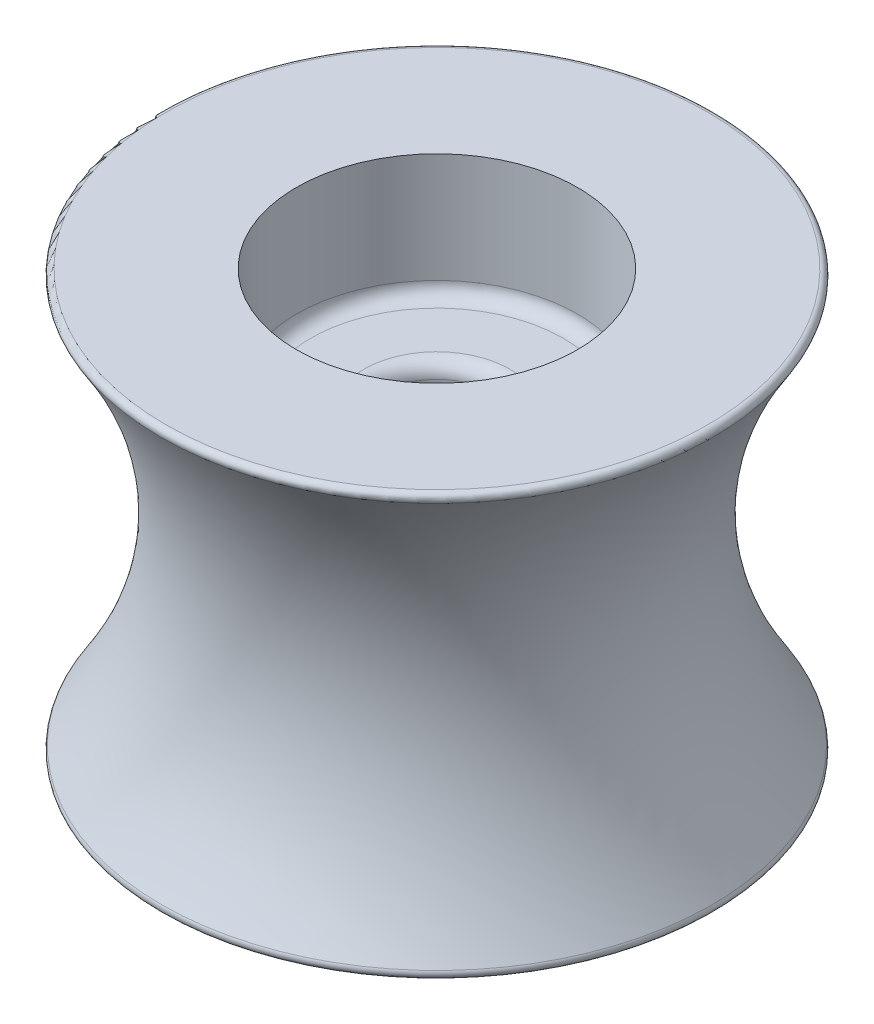
ISO-10303-21;
HEADER;
FILE_DESCRIPTION(('STEP AP214'),'2;1');
FILE_NAME('part.step','',(''),(''),'','','');
FILE_SCHEMA(('AUTOMOTIVE_DESIGN { 1 0 10303 214 1 1 1 1 }'));
ENDSEC;
DATA;
#1=APPLICATION_CONTEXT('core data for automotive mechanical design processes');
#2=APPLICATION_PROTOCOL_DEFINITION('international standard','automotive_design',2000,#1);
#3=PRODUCT_CONTEXT('',#1,'mechanical');
#4=PRODUCT('Part','Part','',(#3));
#5=PRODUCT_RELATED_PRODUCT_CATEGORY('part','',(#4));
#6=PRODUCT_DEFINITION_FORMATION('','',#4);
#7=PRODUCT_DEFINITION_CONTEXT('part definition',#1,'design');
#8=PRODUCT_DEFINITION('design','',#6,#7);
#9=PRODUCT_DEFINITION_SHAPE('','',#8);
#10=(LENGTH_UNIT() NAMED_UNIT(*) SI_UNIT(.MILLI.,.METRE.));
#11=(NAMED_UNIT(*) PLANE_ANGLE_UNIT() SI_UNIT($,.RADIAN.));
#12=(NAMED_UNIT(*) SI_UNIT($,.STERADIAN.) SOLID_ANGLE_UNIT());
#13=UNCERTAINTY_MEASURE_WITH_UNIT(LENGTH_MEASURE(1.E-05),#10,'distance_accuracy_value','');
#14=(GEOMETRIC_REPRESENTATION_CONTEXT(3) GLOBAL_UNCERTAINTY_ASSIGNED_CONTEXT((#13)) GLOBAL_UNIT_ASSIGNED_CONTEXT((#10,
#11,#12)) REPRESENTATION_CONTEXT('',''));
#15=CARTESIAN_POINT('',(0.,0.,0.));
#16=DIRECTION('',(0.,0.,1.));
#17=DIRECTION('',(1.,0.,0.));
#18=AXIS2_PLACEMENT_3D('',#15,#16,#17);
#19=CARTESIAN_POINT('',(0.,-9.525,0.));
#20=DIRECTION('',(0.,1.,0.));
#21=DIRECTION('',(0.,0.,1.));
#22=AXIS2_PLACEMENT_3D('',#19,#20,#21);
#23=CYLINDRICAL_SURFACE('',#22,2.667);
#24=CARTESIAN_POINT('',(0.,-3.302,0.));
#25=DIRECTION('',(0.,-1.,0.));
#26=DIRECTION('',(0.,0.,-1.));
#27=AXIS2_PLACEMENT_3D('',#24,#25,#26);
#28=CIRCLE('',#27,2.667);
#29=CARTESIAN_POINT('',(0.,-3.302,-2.667));
#30=VERTEX_POINT('',#29);
#31=EDGE_CURVE('E45',#30,#30,#28,.T.);
#32=ORIENTED_EDGE('',*,*,#31,.T.);
#33=EDGE_LOOP('',(#32));
#34=FACE_BOUND('',#33,.T.);
#35=CARTESIAN_POINT('',(0.,3.302,0.));
#36=DIRECTION('',(0.,1.,0.));
#37=DIRECTION('',(0.,0.,1.));
#38=AXIS2_PLACEMENT_3D('',#35,#36,#37);
#39=CIRCLE('',#38,2.667);
#40=CARTESIAN_POINT('',(0.,3.302,2.667));
#41=VERTEX_POINT('',#40);
#42=EDGE_CURVE('E50',#41,#41,#39,.T.);
#43=ORIENTED_EDGE('',*,*,#42,.T.);
#44=EDGE_LOOP('',(#43));
#45=FACE_BOUND('',#44,.T.);
#46=ADVANCED_FACE('F37',(#34,#45),#23,.F.);
#47=CARTESIAN_POINT('',(0.,9.525,0.));
#48=DIRECTION('',(0.,-1.,0.));
#49=DIRECTION('',(0.,0.,-1.));
#50=AXIS2_PLACEMENT_3D('',#47,#48,#49);
#51=PLANE('',#50);
#52=CARTESIAN_POINT('',(0.,9.525,0.));
#53=DIRECTION('',(0.,-1.,0.));
#54=DIRECTION('',(0.,0.,-1.));
#55=AXIS2_PLACEMENT_3D('',#52,#53,#54);
#56=CIRCLE('',#55,12.2307979026779);
#57=CARTESIAN_POINT('',(0.,9.525,-12.2307979026779));
#58=VERTEX_POINT('',#57);
#59=EDGE_CURVE('E77',#58,#58,#56,.F.);
#60=ORIENTED_EDGE('',*,*,#59,.T.);
#61=EDGE_LOOP('',(#60));
#62=FACE_BOUND('',#61,.T.);
#63=CARTESIAN_POINT('',(0.,9.525,0.));
#64=DIRECTION('',(0.,1.,0.));
#65=DIRECTION('',(0.,0.,1.));
#66=AXIS2_PLACEMENT_3D('',#63,#64,#65);
#67=CIRCLE('',#66,6.35);
#68=CARTESIAN_POINT('',(0.,9.525,6.35));
#69=VERTEX_POINT('',#68);
#70=EDGE_CURVE('E93',#69,#69,#67,.T.);
#71=ORIENTED_EDGE('',*,*,#70,.F.);
#72=EDGE_LOOP('',(#71));
#73=FACE_BOUND('',#72,.T.);
#74=ADVANCED_FACE('F108',(#62,#73),#51,.F.);
#75=CARTESIAN_POINT('',(12.7,-9.525,0.));
#76=CARTESIAN_POINT('',(6.35,0.,0.));
#77=CARTESIAN_POINT('',(12.7,9.525,0.));
#78=B_SPLINE_CURVE_WITH_KNOTS('',2,(#75,#76,#77),.UNSPECIFIED.,.F.,.F.,(3,3),(0.,1.),.UNSPECIFIED.);
#79=CARTESIAN_POINT('',(0.,9.525,0.));
#80=DIRECTION('',(0.,1.,0.));
#81=AXIS1_PLACEMENT('',#79,#80);
#82=SURFACE_OF_REVOLUTION('',#78,#81);
#83=CARTESIAN_POINT('',(0.,-9.13418467484588,0.));
#84=DIRECTION('',(0.,1.,0.));
#85=DIRECTION('',(0.,0.,1.));
#86=AXIS2_PLACEMENT_3D('',#83,#84,#85);
#87=CIRCLE('',#86,12.4448015634012);
#88=CARTESIAN_POINT('',(0.,-9.13418467484588,12.4448015634012));
#89=VERTEX_POINT('',#88);
#90=EDGE_CURVE('E85',#89,#89,#87,.T.);
#91=ORIENTED_EDGE('',*,*,#90,.T.);
#92=EDGE_LOOP('',(#91));
#93=FACE_BOUND('',#92,.T.);
#94=CARTESIAN_POINT('',(0.,9.13418467484587,0.));
#95=DIRECTION('',(0.,1.,0.));
#96=DIRECTION('',(0.,0.,1.));
#97=AXIS2_PLACEMENT_3D('',#94,#95,#96);
#98=CIRCLE('',#97,12.4448015634012);
#99=CARTESIAN_POINT('',(0.,9.13418467484587,12.4448015634012));
#100=VERTEX_POINT('',#99);
#101=EDGE_CURVE('E89',#100,#100,#98,.F.);
#102=ORIENTED_EDGE('',*,*,#101,.T.);
#103=EDGE_LOOP('',(#102));
#104=FACE_BOUND('',#103,.T.);
#105=ADVANCED_FACE('F103',(#93,#104),#82,.T.);
#106=CARTESIAN_POINT('',(0.,-9.525,0.));
#107=DIRECTION('',(0.,1.,0.));
#108=DIRECTION('',(0.,0.,1.));
#109=AXIS2_PLACEMENT_3D('',#106,#107,#108);
#110=PLANE('',#109);
#111=CARTESIAN_POINT('',(0.,-9.525,0.));
#112=DIRECTION('',(0.,1.,0.));
#113=DIRECTION('',(0.,0.,1.));
#114=AXIS2_PLACEMENT_3D('',#111,#112,#113);
#115=CIRCLE('',#114,12.2307979026779);
#116=CARTESIAN_POINT('',(0.,-9.525,12.2307979026779));
#117=VERTEX_POINT('',#116);
#118=EDGE_CURVE('E81',#117,#117,#115,.F.);
#119=ORIENTED_EDGE('',*,*,#118,.T.);
#120=EDGE_LOOP('',(#119));
#121=FACE_BOUND('',#120,.T.);
#122=CARTESIAN_POINT('',(0.,-9.525,0.));
#123=DIRECTION('',(0.,1.,0.));
#124=DIRECTION('',(0.,0.,1.));
#125=AXIS2_PLACEMENT_3D('',#122,#123,#124);
#126=CIRCLE('',#125,6.35);
#127=CARTESIAN_POINT('',(0.,-9.525,6.35));
#128=VERTEX_POINT('',#127);
#129=EDGE_CURVE('E166',#128,#128,#126,.T.);
#130=ORIENTED_EDGE('',*,*,#129,.T.);
#131=EDGE_LOOP('',(#130));
#132=FACE_BOUND('',#131,.T.);
#133=ADVANCED_FACE('F107',(#121,#132),#110,.F.);
#134=CARTESIAN_POINT('',(0.,3.937,0.));
#135=DIRECTION('',(0.,1.,0.));
#136=DIRECTION('',(0.,0.,1.));
#137=AXIS2_PLACEMENT_3D('',#134,#135,#136);
#138=PLANE('',#137);
#139=CARTESIAN_POINT('',(0.,3.937,0.));
#140=DIRECTION('',(0.,1.,0.));
#141=DIRECTION('',(0.,0.,1.));
#142=AXIS2_PLACEMENT_3D('',#139,#140,#141);
#143=CIRCLE('',#142,3.302);
#144=CARTESIAN_POINT('',(0.,3.937,3.302));
#145=VERTEX_POINT('',#144);
#146=EDGE_CURVE('E10',#145,#145,#143,.F.);
#147=ORIENTED_EDGE('',*,*,#146,.T.);
#148=EDGE_LOOP('',(#147));
#149=FACE_BOUND('',#148,.T.);
#150=CARTESIAN_POINT('',(0.,3.937,0.));
#151=DIRECTION('',(0.,1.,0.));
#152=DIRECTION('',(0.,0.,1.));
#153=AXIS2_PLACEMENT_3D('',#150,#151,#152);
#154=CIRCLE('',#153,5.715);
#155=CARTESIAN_POINT('',(0.,3.937,5.715));
#156=VERTEX_POINT('',#155);
#157=EDGE_CURVE('E65',#156,#156,#154,.T.);
#158=ORIENTED_EDGE('',*,*,#157,.T.);
#159=EDGE_LOOP('',(#158));
#160=FACE_BOUND('',#159,.T.);
#161=ADVANCED_FACE('F147',(#149,#160),#138,.T.);
#162=CARTESIAN_POINT('',(0.,3.937,0.));
#163=DIRECTION('',(0.,1.,0.));
#164=DIRECTION('',(0.,0.,1.));
#165=AXIS2_PLACEMENT_3D('',#162,#163,#164);
#166=CYLINDRICAL_SURFACE('',#165,6.35);
#167=CARTESIAN_POINT('',(0.,4.572,0.));
#168=DIRECTION('',(0.,1.,0.));
#169=DIRECTION('',(0.,0.,1.));
#170=AXIS2_PLACEMENT_3D('',#167,#168,#169);
#171=CIRCLE('',#170,6.35);
#172=CARTESIAN_POINT('',(0.,4.572,6.35));
#173=VERTEX_POINT('',#172);
#174=EDGE_CURVE('E61',#173,#173,#171,.F.);
#175=ORIENTED_EDGE('',*,*,#174,.T.);
#176=EDGE_LOOP('',(#175));
#177=FACE_BOUND('',#176,.T.);
#178=ORIENTED_EDGE('',*,*,#70,.T.);
#179=EDGE_LOOP('',(#178));
#180=FACE_BOUND('',#179,.T.);
#181=ADVANCED_FACE('F143',(#177,#180),#166,.F.);
#182=CARTESIAN_POINT('',(0.,-3.937,0.));
#183=DIRECTION('',(0.,-1.,0.));
#184=DIRECTION('',(0.,0.,1.));
#185=AXIS2_PLACEMENT_3D('',#182,#183,#184);
#186=PLANE('',#185);
#187=CARTESIAN_POINT('',(0.,-3.937,0.));
#188=DIRECTION('',(0.,-1.,0.));
#189=DIRECTION('',(0.,0.,-1.));
#190=AXIS2_PLACEMENT_3D('',#187,#188,#189);
#191=CIRCLE('',#190,3.302);
#192=CARTESIAN_POINT('',(0.,-3.937,-3.302));
#193=VERTEX_POINT('',#192);
#194=EDGE_CURVE('E55',#193,#193,#191,.F.);
#195=ORIENTED_EDGE('',*,*,#194,.T.);
#196=EDGE_LOOP('',(#195));
#197=FACE_BOUND('',#196,.T.);
#198=CARTESIAN_POINT('',(0.,-3.937,0.));
#199=DIRECTION('',(0.,-1.,0.));
#200=DIRECTION('',(0.,0.,-1.));
#201=AXIS2_PLACEMENT_3D('',#198,#199,#200);
#202=CIRCLE('',#201,5.715);
#203=CARTESIAN_POINT('',(0.,-3.937,-5.715));
#204=VERTEX_POINT('',#203);
#205=EDGE_CURVE('E69',#204,#204,#202,.T.);
#206=ORIENTED_EDGE('',*,*,#205,.T.);
#207=EDGE_LOOP('',(#206));
#208=FACE_BOUND('',#207,.T.);
#209=ADVANCED_FACE('F146',(#197,#208),#186,.T.);
#210=CARTESIAN_POINT('',(0.,-3.937,0.));
#211=DIRECTION('',(0.,-1.,0.));
#212=DIRECTION('',(0.,0.,-1.));
#213=AXIS2_PLACEMENT_3D('',#210,#211,#212);
#214=CYLINDRICAL_SURFACE('',#213,6.35);
#215=CARTESIAN_POINT('',(0.,-4.572,0.));
#216=DIRECTION('',(0.,-1.,0.));
#217=DIRECTION('',(0.,0.,-1.));
#218=AXIS2_PLACEMENT_3D('',#215,#216,#217);
#219=CIRCLE('',#218,6.35);
#220=CARTESIAN_POINT('',(0.,-4.572,-6.35));
#221=VERTEX_POINT('',#220);
#222=EDGE_CURVE('E73',#221,#221,#219,.F.);
#223=ORIENTED_EDGE('',*,*,#222,.T.);
#224=EDGE_LOOP('',(#223));
#225=FACE_BOUND('',#224,.T.);
#226=ORIENTED_EDGE('',*,*,#129,.F.);
#227=EDGE_LOOP('',(#226));
#228=FACE_BOUND('',#227,.T.);
#229=ADVANCED_FACE('F118',(#225,#228),#214,.F.);
#230=CARTESIAN_POINT('',(0.,-9.271,0.));
#231=DIRECTION('',(0.,1.,0.));
#232=DIRECTION('',(0.,0.,1.));
#233=AXIS2_PLACEMENT_3D('',#230,#231,#232);
#234=TOROIDAL_SURFACE('',#233,12.2307979026779,0.254);
#235=ORIENTED_EDGE('',*,*,#118,.F.);
#236=EDGE_LOOP('',(#235));
#237=FACE_BOUND('',#236,.T.);
#238=ORIENTED_EDGE('',*,*,#90,.F.);
#239=EDGE_LOOP('',(#238));
#240=FACE_BOUND('',#239,.T.);
#241=ADVANCED_FACE('F114',(#237,#240),#234,.T.);
#242=CARTESIAN_POINT('',(0.,9.271,0.));
#243=DIRECTION('',(0.,1.,0.));
#244=DIRECTION('',(0.,0.,1.));
#245=AXIS2_PLACEMENT_3D('',#242,#243,#244);
#246=TOROIDAL_SURFACE('',#245,12.2307979026779,0.254);
#247=ORIENTED_EDGE('',*,*,#101,.F.);
#248=EDGE_LOOP('',(#247));
#249=FACE_BOUND('',#248,.T.);
#250=ORIENTED_EDGE('',*,*,#59,.F.);
#251=EDGE_LOOP('',(#250));
#252=FACE_BOUND('',#251,.T.);
#253=ADVANCED_FACE('F117',(#249,#252),#246,.T.);
#254=CARTESIAN_POINT('',(0.,-4.572,0.));
#255=DIRECTION('',(0.,-1.,0.));
#256=DIRECTION('',(0.,0.,-1.));
#257=AXIS2_PLACEMENT_3D('',#254,#255,#256);
#258=TOROIDAL_SURFACE('',#257,5.715,0.635);
#259=ORIENTED_EDGE('',*,*,#205,.F.);
#260=EDGE_LOOP('',(#259));
#261=FACE_BOUND('',#260,.T.);
#262=ORIENTED_EDGE('',*,*,#222,.F.);
#263=EDGE_LOOP('',(#262));
#264=FACE_BOUND('',#263,.T.);
#265=ADVANCED_FACE('F122',(#261,#264),#258,.F.);
#266=CARTESIAN_POINT('',(0.,4.572,0.));
#267=DIRECTION('',(0.,1.,0.));
#268=DIRECTION('',(0.,0.,1.));
#269=AXIS2_PLACEMENT_3D('',#266,#267,#268);
#270=TOROIDAL_SURFACE('',#269,5.715,0.635);
#271=ORIENTED_EDGE('',*,*,#174,.F.);
#272=EDGE_LOOP('',(#271));
#273=FACE_BOUND('',#272,.T.);
#274=ORIENTED_EDGE('',*,*,#157,.F.);
#275=EDGE_LOOP('',(#274));
#276=FACE_BOUND('',#275,.T.);
#277=ADVANCED_FACE('F126',(#273,#276),#270,.F.);
#278=CARTESIAN_POINT('',(0.,-3.302,0.));
#279=DIRECTION('',(0.,-1.,0.));
#280=DIRECTION('',(0.,0.,-1.));
#281=AXIS2_PLACEMENT_3D('',#278,#279,#280);
#282=TOROIDAL_SURFACE('',#281,3.302,0.635);
#283=ORIENTED_EDGE('',*,*,#31,.F.);
#284=EDGE_LOOP('',(#283));
#285=FACE_BOUND('',#284,.T.);
#286=ORIENTED_EDGE('',*,*,#194,.F.);
#287=EDGE_LOOP('',(#286));
#288=FACE_BOUND('',#287,.T.);
#289=ADVANCED_FACE('F129',(#285,#288),#282,.T.);
#290=CARTESIAN_POINT('',(0.,3.302,0.));
#291=DIRECTION('',(0.,1.,0.));
#292=DIRECTION('',(0.,0.,1.));
#293=AXIS2_PLACEMENT_3D('',#290,#291,#292);
#294=TOROIDAL_SURFACE('',#293,3.302,0.635);
#295=ORIENTED_EDGE('',*,*,#42,.F.);
#296=EDGE_LOOP('',(#295));
#297=FACE_BOUND('',#296,.T.);
#298=ORIENTED_EDGE('',*,*,#146,.F.);
#299=EDGE_LOOP('',(#298));
#300=FACE_BOUND('',#299,.T.);
#301=ADVANCED_FACE('F39',(#297,#300),#294,.T.);
#302=CLOSED_SHELL('',(#46,#74,#105,#133,#161,#181,#209,#229,#241,#253,#265,#277,#289,#301));
#303=MANIFOLD_SOLID_BREP('B2',#302);
#304=ADVANCED_BREP_SHAPE_REPRESENTATION('',(#18,#303),#14);
#305=SHAPE_DEFINITION_REPRESENTATION(#9,#304);
ENDSEC;
END-ISO-10303-21;
